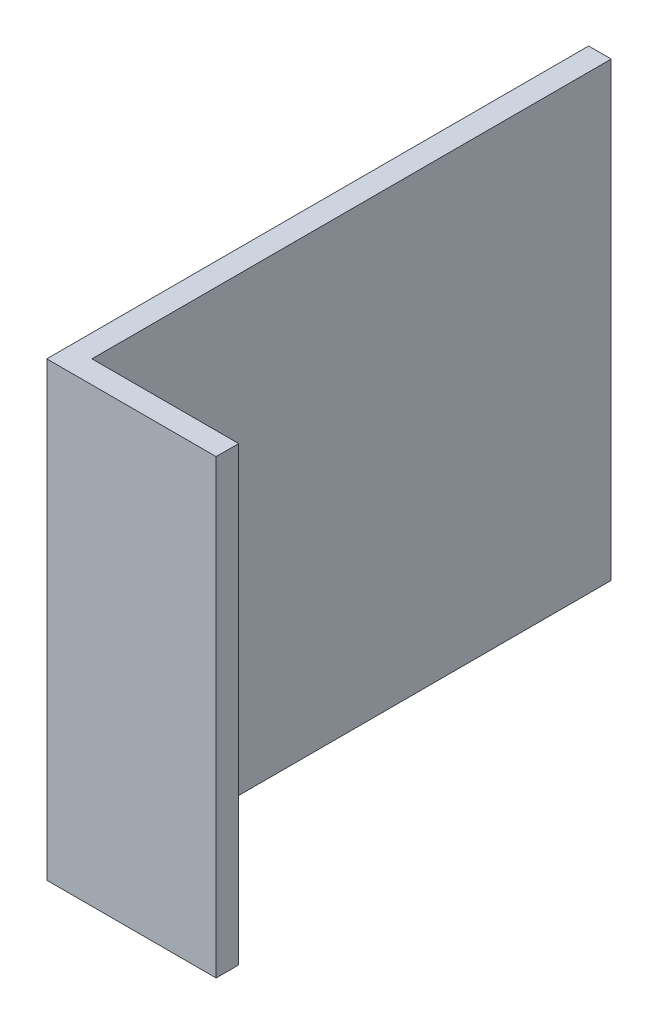
ISO-10303-21;
HEADER;
FILE_DESCRIPTION(('STEP AP214'),'2;1');
FILE_NAME('part.step','',(''),(''),'','','');
FILE_SCHEMA(('AUTOMOTIVE_DESIGN { 1 0 10303 214 1 1 1 1 }'));
ENDSEC;
DATA;
#1=APPLICATION_CONTEXT('core data for automotive mechanical design processes');
#2=APPLICATION_PROTOCOL_DEFINITION('international standard','automotive_design',2000,#1);
#3=PRODUCT_CONTEXT('',#1,'mechanical');
#4=PRODUCT('Part','Part','',(#3));
#5=PRODUCT_RELATED_PRODUCT_CATEGORY('part','',(#4));
#6=PRODUCT_DEFINITION_FORMATION('','',#4);
#7=PRODUCT_DEFINITION_CONTEXT('part definition',#1,'design');
#8=PRODUCT_DEFINITION('design','',#6,#7);
#9=PRODUCT_DEFINITION_SHAPE('','',#8);
#10=(LENGTH_UNIT() NAMED_UNIT(*) SI_UNIT(.MILLI.,.METRE.));
#11=(NAMED_UNIT(*) PLANE_ANGLE_UNIT() SI_UNIT($,.RADIAN.));
#12=(NAMED_UNIT(*) SI_UNIT($,.STERADIAN.) SOLID_ANGLE_UNIT());
#13=UNCERTAINTY_MEASURE_WITH_UNIT(LENGTH_MEASURE(1.E-05),#10,'distance_accuracy_value','');
#14=(GEOMETRIC_REPRESENTATION_CONTEXT(3) GLOBAL_UNCERTAINTY_ASSIGNED_CONTEXT((#13)) GLOBAL_UNIT_ASSIGNED_CONTEXT((#10,
#11,#12)) REPRESENTATION_CONTEXT('',''));
#15=CARTESIAN_POINT('',(0.,0.,0.));
#16=DIRECTION('',(0.,0.,1.));
#17=DIRECTION('',(1.,0.,0.));
#18=AXIS2_PLACEMENT_3D('',#15,#16,#17);
#19=CARTESIAN_POINT('',(0.,63.5,-76.2));
#20=DIRECTION('',(0.,0.,1.));
#21=DIRECTION('',(1.,0.,0.));
#22=AXIS2_PLACEMENT_3D('',#19,#20,#21);
#23=PLANE('',#22);
#24=DIRECTION('',(-1.,0.,0.));
#25=VECTOR('',#24,1.);
#26=CARTESIAN_POINT('',(0.,0.,-76.2));
#27=LINE('',#26,#25);
#28=CARTESIAN_POINT('',(3.175,0.,-76.2));
#29=VERTEX_POINT('',#28);
#30=CARTESIAN_POINT('',(0.,0.,-76.2));
#31=VERTEX_POINT('',#30);
#32=EDGE_CURVE('E121',#29,#31,#27,.T.);
#33=ORIENTED_EDGE('',*,*,#32,.T.);
#34=DIRECTION('',(0.,-1.,0.));
#35=VECTOR('',#34,1.);
#36=CARTESIAN_POINT('',(0.,63.5,-76.2));
#37=LINE('',#36,#35);
#38=CARTESIAN_POINT('',(0.,63.5,-76.2));
#39=VERTEX_POINT('',#38);
#40=EDGE_CURVE('E11',#39,#31,#37,.T.);
#41=ORIENTED_EDGE('',*,*,#40,.F.);
#42=DIRECTION('',(-1.,0.,0.));
#43=VECTOR('',#42,1.);
#44=CARTESIAN_POINT('',(0.,63.5,-76.2));
#45=LINE('',#44,#43);
#46=CARTESIAN_POINT('',(3.175,63.5,-76.2));
#47=VERTEX_POINT('',#46);
#48=EDGE_CURVE('E131',#47,#39,#45,.T.);
#49=ORIENTED_EDGE('',*,*,#48,.F.);
#50=DIRECTION('',(0.,-1.,0.));
#51=VECTOR('',#50,1.);
#52=CARTESIAN_POINT('',(3.175,63.5,-76.2));
#53=LINE('',#52,#51);
#54=EDGE_CURVE('E117',#47,#29,#53,.T.);
#55=ORIENTED_EDGE('',*,*,#54,.T.);
#56=EDGE_LOOP('',(#33,#41,#49,#55));
#57=FACE_BOUND('',#56,.T.);
#58=ADVANCED_FACE('F37',(#57),#23,.F.);
#59=CARTESIAN_POINT('',(0.,63.5,-76.2));
#60=DIRECTION('',(1.,0.,0.));
#61=DIRECTION('',(0.,0.,-1.));
#62=AXIS2_PLACEMENT_3D('',#59,#60,#61);
#63=PLANE('',#62);
#64=DIRECTION('',(0.,0.,1.));
#65=VECTOR('',#64,1.);
#66=CARTESIAN_POINT('',(0.,0.,-76.2));
#67=LINE('',#66,#65);
#68=CARTESIAN_POINT('',(0.,0.,0.));
#69=VERTEX_POINT('',#68);
#70=EDGE_CURVE('E124',#31,#69,#67,.T.);
#71=ORIENTED_EDGE('',*,*,#70,.T.);
#72=DIRECTION('',(0.,-1.,0.));
#73=VECTOR('',#72,1.);
#74=CARTESIAN_POINT('',(0.,63.5,0.));
#75=LINE('',#74,#73);
#76=CARTESIAN_POINT('',(0.,63.5,0.));
#77=VERTEX_POINT('',#76);
#78=EDGE_CURVE('E45',#77,#69,#75,.T.);
#79=ORIENTED_EDGE('',*,*,#78,.F.);
#80=DIRECTION('',(0.,0.,1.));
#81=VECTOR('',#80,1.);
#82=CARTESIAN_POINT('',(0.,63.5,-76.2));
#83=LINE('',#82,#81);
#84=EDGE_CURVE('E90',#39,#77,#83,.T.);
#85=ORIENTED_EDGE('',*,*,#84,.F.);
#86=ORIENTED_EDGE('',*,*,#40,.T.);
#87=EDGE_LOOP('',(#71,#79,#85,#86));
#88=FACE_BOUND('',#87,.T.);
#89=ADVANCED_FACE('F155',(#88),#63,.F.);
#90=CARTESIAN_POINT('',(0.,63.5,0.));
#91=DIRECTION('',(0.,0.,-1.));
#92=DIRECTION('',(-1.,0.,0.));
#93=AXIS2_PLACEMENT_3D('',#90,#91,#92);
#94=PLANE('',#93);
#95=DIRECTION('',(1.,0.,0.));
#96=VECTOR('',#95,1.);
#97=CARTESIAN_POINT('',(0.,0.,0.));
#98=LINE('',#97,#96);
#99=CARTESIAN_POINT('',(23.8125,0.,0.));
#100=VERTEX_POINT('',#99);
#101=EDGE_CURVE('E126',#69,#100,#98,.T.);
#102=ORIENTED_EDGE('',*,*,#101,.T.);
#103=DIRECTION('',(0.,-1.,0.));
#104=VECTOR('',#103,1.);
#105=CARTESIAN_POINT('',(23.8125,63.5,0.));
#106=LINE('',#105,#104);
#107=CARTESIAN_POINT('',(23.8125,63.5,0.));
#108=VERTEX_POINT('',#107);
#109=EDGE_CURVE('E112',#108,#100,#106,.T.);
#110=ORIENTED_EDGE('',*,*,#109,.F.);
#111=DIRECTION('',(1.,0.,0.));
#112=VECTOR('',#111,1.);
#113=CARTESIAN_POINT('',(0.,63.5,0.));
#114=LINE('',#113,#112);
#115=EDGE_CURVE('E103',#77,#108,#114,.T.);
#116=ORIENTED_EDGE('',*,*,#115,.F.);
#117=ORIENTED_EDGE('',*,*,#78,.T.);
#118=EDGE_LOOP('',(#102,#110,#116,#117));
#119=FACE_BOUND('',#118,.T.);
#120=ADVANCED_FACE('F137',(#119),#94,.F.);
#121=CARTESIAN_POINT('',(23.8125,63.5,-3.175));
#122=DIRECTION('',(-1.,0.,0.));
#123=DIRECTION('',(0.,0.,1.));
#124=AXIS2_PLACEMENT_3D('',#121,#122,#123);
#125=PLANE('',#124);
#126=DIRECTION('',(0.,0.,-1.));
#127=VECTOR('',#126,1.);
#128=CARTESIAN_POINT('',(23.8125,0.,-3.175));
#129=LINE('',#128,#127);
#130=CARTESIAN_POINT('',(23.8125,0.,-3.175));
#131=VERTEX_POINT('',#130);
#132=EDGE_CURVE('E111',#100,#131,#129,.T.);
#133=ORIENTED_EDGE('',*,*,#132,.T.);
#134=DIRECTION('',(0.,-1.,0.));
#135=VECTOR('',#134,1.);
#136=CARTESIAN_POINT('',(23.8125,63.5,-3.175));
#137=LINE('',#136,#135);
#138=CARTESIAN_POINT('',(23.8125,63.5,-3.175));
#139=VERTEX_POINT('',#138);
#140=EDGE_CURVE('E108',#139,#131,#137,.T.);
#141=ORIENTED_EDGE('',*,*,#140,.F.);
#142=DIRECTION('',(0.,0.,-1.));
#143=VECTOR('',#142,1.);
#144=CARTESIAN_POINT('',(23.8125,63.5,-3.175));
#145=LINE('',#144,#143);
#146=EDGE_CURVE('E97',#108,#139,#145,.T.);
#147=ORIENTED_EDGE('',*,*,#146,.F.);
#148=ORIENTED_EDGE('',*,*,#109,.T.);
#149=EDGE_LOOP('',(#133,#141,#147,#148));
#150=FACE_BOUND('',#149,.T.);
#151=ADVANCED_FACE('F109',(#150),#125,.F.);
#152=CARTESIAN_POINT('',(3.175,63.5,-3.175));
#153=DIRECTION('',(0.,0.,1.));
#154=DIRECTION('',(1.,0.,0.));
#155=AXIS2_PLACEMENT_3D('',#152,#153,#154);
#156=PLANE('',#155);
#157=DIRECTION('',(-1.,0.,0.));
#158=VECTOR('',#157,1.);
#159=CARTESIAN_POINT('',(3.175,0.,-3.175));
#160=LINE('',#159,#158);
#161=CARTESIAN_POINT('',(3.175,0.,-3.175));
#162=VERTEX_POINT('',#161);
#163=EDGE_CURVE('E76',#131,#162,#160,.T.);
#164=ORIENTED_EDGE('',*,*,#163,.T.);
#165=DIRECTION('',(0.,-1.,0.));
#166=VECTOR('',#165,1.);
#167=CARTESIAN_POINT('',(3.175,63.5,-3.175));
#168=LINE('',#167,#166);
#169=CARTESIAN_POINT('',(3.175,63.5,-3.175));
#170=VERTEX_POINT('',#169);
#171=EDGE_CURVE('E113',#170,#162,#168,.T.);
#172=ORIENTED_EDGE('',*,*,#171,.F.);
#173=DIRECTION('',(-1.,0.,0.));
#174=VECTOR('',#173,1.);
#175=CARTESIAN_POINT('',(3.175,63.5,-3.175));
#176=LINE('',#175,#174);
#177=EDGE_CURVE('E101',#139,#170,#176,.T.);
#178=ORIENTED_EDGE('',*,*,#177,.F.);
#179=ORIENTED_EDGE('',*,*,#140,.T.);
#180=EDGE_LOOP('',(#164,#172,#178,#179));
#181=FACE_BOUND('',#180,.T.);
#182=ADVANCED_FACE('F115',(#181),#156,.F.);
#183=CARTESIAN_POINT('',(3.175,63.5,-76.2));
#184=DIRECTION('',(-1.,0.,0.));
#185=DIRECTION('',(0.,0.,1.));
#186=AXIS2_PLACEMENT_3D('',#183,#184,#185);
#187=PLANE('',#186);
#188=DIRECTION('',(0.,0.,-1.));
#189=VECTOR('',#188,1.);
#190=CARTESIAN_POINT('',(3.175,0.,-76.2));
#191=LINE('',#190,#189);
#192=EDGE_CURVE('E82',#162,#29,#191,.T.);
#193=ORIENTED_EDGE('',*,*,#192,.T.);
#194=ORIENTED_EDGE('',*,*,#54,.F.);
#195=DIRECTION('',(0.,0.,-1.));
#196=VECTOR('',#195,1.);
#197=CARTESIAN_POINT('',(3.175,63.5,-76.2));
#198=LINE('',#197,#196);
#199=EDGE_CURVE('E53',#170,#47,#198,.T.);
#200=ORIENTED_EDGE('',*,*,#199,.F.);
#201=ORIENTED_EDGE('',*,*,#171,.T.);
#202=EDGE_LOOP('',(#193,#194,#200,#201));
#203=FACE_BOUND('',#202,.T.);
#204=ADVANCED_FACE('F144',(#203),#187,.F.);
#205=CARTESIAN_POINT('',(0.,63.5,0.));
#206=DIRECTION('',(0.,-1.,0.));
#207=DIRECTION('',(0.,0.,-1.));
#208=AXIS2_PLACEMENT_3D('',#205,#206,#207);
#209=PLANE('',#208);
#210=ORIENTED_EDGE('',*,*,#48,.T.);
#211=ORIENTED_EDGE('',*,*,#84,.T.);
#212=ORIENTED_EDGE('',*,*,#115,.T.);
#213=ORIENTED_EDGE('',*,*,#146,.T.);
#214=ORIENTED_EDGE('',*,*,#177,.T.);
#215=ORIENTED_EDGE('',*,*,#199,.T.);
#216=EDGE_LOOP('',(#210,#211,#212,#213,#214,#215));
#217=FACE_BOUND('',#216,.T.);
#218=ADVANCED_FACE('F99',(#217),#209,.F.);
#219=CARTESIAN_POINT('',(0.,0.,0.));
#220=DIRECTION('',(0.,-1.,0.));
#221=DIRECTION('',(0.,0.,-1.));
#222=AXIS2_PLACEMENT_3D('',#219,#220,#221);
#223=PLANE('',#222);
#224=ORIENTED_EDGE('',*,*,#32,.F.);
#225=ORIENTED_EDGE('',*,*,#192,.F.);
#226=ORIENTED_EDGE('',*,*,#163,.F.);
#227=ORIENTED_EDGE('',*,*,#132,.F.);
#228=ORIENTED_EDGE('',*,*,#101,.F.);
#229=ORIENTED_EDGE('',*,*,#70,.F.);
#230=EDGE_LOOP('',(#224,#225,#226,#227,#228,#229));
#231=FACE_BOUND('',#230,.T.);
#232=ADVANCED_FACE('F140',(#231),#223,.T.);
#233=CLOSED_SHELL('',(#58,#89,#120,#151,#182,#204,#218,#232));
#234=MANIFOLD_SOLID_BREP('B2',#233);
#235=ADVANCED_BREP_SHAPE_REPRESENTATION('',(#18,#234),#14);
#236=SHAPE_DEFINITION_REPRESENTATION(#9,#235);
ENDSEC;
END-ISO-10303-21;
